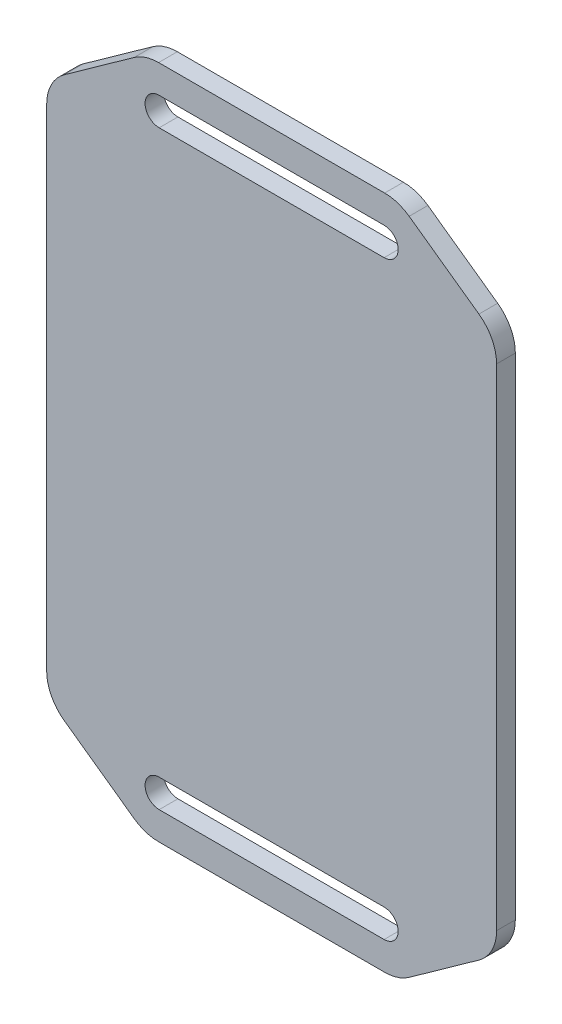
ISO-10303-21;
HEADER;
FILE_DESCRIPTION(('STEP AP214'),'2;1');
FILE_NAME('part.step','',(''),(''),'','','');
FILE_SCHEMA(('AUTOMOTIVE_DESIGN { 1 0 10303 214 1 1 1 1 }'));
ENDSEC;
DATA;
#1=APPLICATION_CONTEXT('core data for automotive mechanical design processes');
#2=APPLICATION_PROTOCOL_DEFINITION('international standard','automotive_design',2000,#1);
#3=PRODUCT_CONTEXT('',#1,'mechanical');
#4=PRODUCT('Part','Part','',(#3));
#5=PRODUCT_RELATED_PRODUCT_CATEGORY('part','',(#4));
#6=PRODUCT_DEFINITION_FORMATION('','',#4);
#7=PRODUCT_DEFINITION_CONTEXT('part definition',#1,'design');
#8=PRODUCT_DEFINITION('design','',#6,#7);
#9=PRODUCT_DEFINITION_SHAPE('','',#8);
#10=(LENGTH_UNIT() NAMED_UNIT(*) SI_UNIT(.MILLI.,.METRE.));
#11=(NAMED_UNIT(*) PLANE_ANGLE_UNIT() SI_UNIT($,.RADIAN.));
#12=(NAMED_UNIT(*) SI_UNIT($,.STERADIAN.) SOLID_ANGLE_UNIT());
#13=UNCERTAINTY_MEASURE_WITH_UNIT(LENGTH_MEASURE(1.E-05),#10,'distance_accuracy_value','');
#14=(GEOMETRIC_REPRESENTATION_CONTEXT(3) GLOBAL_UNCERTAINTY_ASSIGNED_CONTEXT((#13)) GLOBAL_UNIT_ASSIGNED_CONTEXT((#10,
#11,#12)) REPRESENTATION_CONTEXT('',''));
#15=CARTESIAN_POINT('',(0.,0.,0.));
#16=DIRECTION('',(0.,0.,1.));
#17=DIRECTION('',(1.,0.,0.));
#18=AXIS2_PLACEMENT_3D('',#15,#16,#17);
#19=CARTESIAN_POINT('',(195.595995895777,161.842834793224,2.));
#20=DIRECTION('',(0.,0.,1.));
#21=DIRECTION('',(1.,0.,0.));
#22=AXIS2_PLACEMENT_3D('',#19,#20,#21);
#23=PLANE('',#22);
#24=DIRECTION('',(1.,0.,0.));
#25=VECTOR('',#24,1.);
#26=CARTESIAN_POINT('',(164.0959958958,155.0270542645,2.));
#27=LINE('',#26,#25);
#28=CARTESIAN_POINT('',(164.0959958958,155.0270542645,2.));
#29=VERTEX_POINT('',#28);
#30=CARTESIAN_POINT('',(188.0959958958,155.0270542645,2.));
#31=VERTEX_POINT('',#30);
#32=EDGE_CURVE('E231',#29,#31,#27,.T.);
#33=ORIENTED_EDGE('',*,*,#32,.F.);
#34=CARTESIAN_POINT('',(164.0959958958,156.5270542645,2.));
#35=DIRECTION('',(0.,0.,1.));
#36=DIRECTION('',(1.,0.,0.));
#37=AXIS2_PLACEMENT_3D('',#34,#35,#36);
#38=CIRCLE('',#37,1.5);
#39=CARTESIAN_POINT('',(164.0959958958,158.0270542645,2.));
#40=VERTEX_POINT('',#39);
#41=EDGE_CURVE('E229',#40,#29,#38,.T.);
#42=ORIENTED_EDGE('',*,*,#41,.F.);
#43=DIRECTION('',(-1.,0.,0.));
#44=VECTOR('',#43,1.);
#45=CARTESIAN_POINT('',(164.0959958958,158.0270542645,2.));
#46=LINE('',#45,#44);
#47=CARTESIAN_POINT('',(188.0959958958,158.0270542645,2.));
#48=VERTEX_POINT('',#47);
#49=EDGE_CURVE('E237',#48,#40,#46,.T.);
#50=ORIENTED_EDGE('',*,*,#49,.F.);
#51=CARTESIAN_POINT('',(188.0959958958,156.5270542645,2.));
#52=DIRECTION('',(0.,0.,1.));
#53=DIRECTION('',(1.,0.,0.));
#54=AXIS2_PLACEMENT_3D('',#51,#52,#53);
#55=CIRCLE('',#54,1.5);
#56=EDGE_CURVE('E234',#31,#48,#55,.T.);
#57=ORIENTED_EDGE('',*,*,#56,.F.);
#58=EDGE_LOOP('',(#33,#42,#50,#57));
#59=FACE_BOUND('',#58,.T.);
#60=CARTESIAN_POINT('',(195.595995895777,161.842834793224,2.));
#61=DIRECTION('',(0.,0.,1.));
#62=DIRECTION('',(1.,0.,0.));
#63=AXIS2_PLACEMENT_3D('',#60,#61,#62);
#64=CIRCLE('',#63,4.50000000000631);
#65=CARTESIAN_POINT('',(198.211567767574,158.181034172829,2.));
#66=VERTEX_POINT('',#65);
#67=CARTESIAN_POINT('',(200.095995895783,161.842834793224,2.));
#68=VERTEX_POINT('',#67);
#69=EDGE_CURVE('E260',#66,#68,#64,.T.);
#70=ORIENTED_EDGE('',*,*,#69,.T.);
#71=DIRECTION('',(0.,1.,0.));
#72=VECTOR('',#71,1.);
#73=CARTESIAN_POINT('',(200.095995895783,161.842834793224,2.));
#74=LINE('',#73,#72);
#75=CARTESIAN_POINT('',(200.095995895783,214.210663326024,2.));
#76=VERTEX_POINT('',#75);
#77=EDGE_CURVE('E263',#68,#76,#74,.T.);
#78=ORIENTED_EDGE('',*,*,#77,.T.);
#79=CARTESIAN_POINT('',(195.595995895777,214.210663326176,2.));
#80=DIRECTION('',(0.,0.,1.));
#81=DIRECTION('',(1.,0.,0.));
#82=AXIS2_PLACEMENT_3D('',#79,#80,#81);
#83=CIRCLE('',#82,4.50000000000633);
#84=CARTESIAN_POINT('',(198.211567767574,217.872463946571,2.));
#85=VERTEX_POINT('',#84);
#86=EDGE_CURVE('E266',#76,#85,#83,.T.);
#87=ORIENTED_EDGE('',*,*,#86,.T.);
#88=DIRECTION('',(-0.81373347120969,0.581238193714959,0.));
#89=VECTOR('',#88,1.);
#90=CARTESIAN_POINT('',(190.769475027174,223.188244475371,2.));
#91=LINE('',#90,#89);
#92=CARTESIAN_POINT('',(190.769475027174,223.188244475371,2.));
#93=VERTEX_POINT('',#92);
#94=EDGE_CURVE('E268',#85,#93,#91,.T.);
#95=ORIENTED_EDGE('',*,*,#94,.T.);
#96=CARTESIAN_POINT('',(188.15390315546,219.526443854953,2.));
#97=DIRECTION('',(0.,0.,1.));
#98=DIRECTION('',(1.,0.,0.));
#99=AXIS2_PLACEMENT_3D('',#96,#97,#98);
#100=CIRCLE('',#99,4.49999999997727);
#101=CARTESIAN_POINT('',(188.15390315546,224.02644385493,2.));
#102=VERTEX_POINT('',#101);
#103=EDGE_CURVE('E270',#93,#102,#100,.T.);
#104=ORIENTED_EDGE('',*,*,#103,.T.);
#105=DIRECTION('',(-1.,0.,0.));
#106=VECTOR('',#105,1.);
#107=CARTESIAN_POINT('',(188.15390315546,224.02644385493,2.));
#108=LINE('',#107,#106);
#109=CARTESIAN_POINT('',(164.03808863616,224.02644385493,2.));
#110=VERTEX_POINT('',#109);
#111=EDGE_CURVE('E272',#102,#110,#108,.T.);
#112=ORIENTED_EDGE('',*,*,#111,.T.);
#113=CARTESIAN_POINT('',(164.03808863616,219.526443854924,2.));
#114=DIRECTION('',(0.,0.,1.));
#115=DIRECTION('',(1.,0.,0.));
#116=AXIS2_PLACEMENT_3D('',#113,#114,#115);
#117=CIRCLE('',#116,4.50000000000631);
#118=CARTESIAN_POINT('',(161.422516764364,223.188244475319,2.));
#119=VERTEX_POINT('',#118);
#120=EDGE_CURVE('E274',#110,#119,#117,.T.);
#121=ORIENTED_EDGE('',*,*,#120,.T.);
#122=DIRECTION('',(-0.813733471205996,-0.581238193720131,0.));
#123=VECTOR('',#122,1.);
#124=CARTESIAN_POINT('',(153.980424024064,217.872463946518,2.));
#125=LINE('',#124,#123);
#126=CARTESIAN_POINT('',(153.980424024064,217.872463946518,2.));
#127=VERTEX_POINT('',#126);
#128=EDGE_CURVE('E276',#119,#127,#125,.T.);
#129=ORIENTED_EDGE('',*,*,#128,.T.);
#130=CARTESIAN_POINT('',(156.595995895777,214.2106633261,2.));
#131=DIRECTION('',(0.,0.,1.));
#132=DIRECTION('',(1.,0.,0.));
#133=AXIS2_PLACEMENT_3D('',#130,#131,#132);
#134=CIRCLE('',#133,4.49999999997724);
#135=CARTESIAN_POINT('',(152.0959958958,214.2106633261,2.));
#136=VERTEX_POINT('',#135);
#137=EDGE_CURVE('E278',#127,#136,#134,.T.);
#138=ORIENTED_EDGE('',*,*,#137,.T.);
#139=DIRECTION('',(0.,-1.,0.));
#140=VECTOR('',#139,1.);
#141=CARTESIAN_POINT('',(152.0959958958,161.8428347933,2.));
#142=LINE('',#141,#140);
#143=CARTESIAN_POINT('',(152.0959958958,161.8428347933,2.));
#144=VERTEX_POINT('',#143);
#145=EDGE_CURVE('E280',#136,#144,#142,.T.);
#146=ORIENTED_EDGE('',*,*,#145,.T.);
#147=CARTESIAN_POINT('',(156.595995895777,161.8428347933,2.));
#148=DIRECTION('',(0.,0.,1.));
#149=DIRECTION('',(1.,0.,0.));
#150=AXIS2_PLACEMENT_3D('',#147,#148,#149);
#151=CIRCLE('',#150,4.49999999997719);
#152=CARTESIAN_POINT('',(153.980424024064,158.181034172881,2.));
#153=VERTEX_POINT('',#152);
#154=EDGE_CURVE('E282',#144,#153,#151,.T.);
#155=ORIENTED_EDGE('',*,*,#154,.T.);
#156=DIRECTION('',(0.813733471205996,-0.581238193720131,0.));
#157=VECTOR('',#156,1.);
#158=CARTESIAN_POINT('',(153.980424024064,158.181034172881,2.));
#159=LINE('',#158,#157);
#160=CARTESIAN_POINT('',(161.422516764364,152.865253644081,2.));
#161=VERTEX_POINT('',#160);
#162=EDGE_CURVE('E284',#153,#161,#159,.T.);
#163=ORIENTED_EDGE('',*,*,#162,.T.);
#164=CARTESIAN_POINT('',(164.03808863616,156.527054264476,2.));
#165=DIRECTION('',(0.,0.,1.));
#166=DIRECTION('',(1.,0.,0.));
#167=AXIS2_PLACEMENT_3D('',#164,#165,#166);
#168=CIRCLE('',#167,4.50000000000623);
#169=CARTESIAN_POINT('',(164.03808863616,152.02705426447,2.));
#170=VERTEX_POINT('',#169);
#171=EDGE_CURVE('E286',#161,#170,#168,.T.);
#172=ORIENTED_EDGE('',*,*,#171,.T.);
#173=DIRECTION('',(1.,0.,0.));
#174=VECTOR('',#173,1.);
#175=CARTESIAN_POINT('',(164.03808863616,152.02705426447,2.));
#176=LINE('',#175,#174);
#177=CARTESIAN_POINT('',(188.15390315546,152.02705426447,2.));
#178=VERTEX_POINT('',#177);
#179=EDGE_CURVE('E288',#170,#178,#176,.T.);
#180=ORIENTED_EDGE('',*,*,#179,.T.);
#181=CARTESIAN_POINT('',(188.15390315546,156.527054264447,2.));
#182=DIRECTION('',(0.,0.,1.));
#183=DIRECTION('',(1.,0.,0.));
#184=AXIS2_PLACEMENT_3D('',#181,#182,#183);
#185=CIRCLE('',#184,4.4999999999772);
#186=CARTESIAN_POINT('',(190.769475027174,152.865253644029,2.));
#187=VERTEX_POINT('',#186);
#188=EDGE_CURVE('E290',#178,#187,#185,.T.);
#189=ORIENTED_EDGE('',*,*,#188,.T.);
#190=DIRECTION('',(0.81373347120969,0.581238193714959,0.));
#191=VECTOR('',#190,1.);
#192=CARTESIAN_POINT('',(190.769475027174,152.865253644029,2.));
#193=LINE('',#192,#191);
#194=EDGE_CURVE('E292',#187,#66,#193,.T.);
#195=ORIENTED_EDGE('',*,*,#194,.T.);
#196=EDGE_LOOP('',(#70,#78,#87,#95,#104,#112,#121,#129,#138,#146,#155,#163,#172,#180,#189,#195));
#197=FACE_BOUND('',#196,.T.);
#198=DIRECTION('',(1.,0.,0.));
#199=VECTOR('',#198,1.);
#200=CARTESIAN_POINT('',(164.0959958958,218.0270542645,2.));
#201=LINE('',#200,#199);
#202=CARTESIAN_POINT('',(164.0959958958,218.0270542645,2.));
#203=VERTEX_POINT('',#202);
#204=CARTESIAN_POINT('',(188.0959958958,218.0270542645,2.));
#205=VERTEX_POINT('',#204);
#206=EDGE_CURVE('E201',#203,#205,#201,.T.);
#207=ORIENTED_EDGE('',*,*,#206,.F.);
#208=CARTESIAN_POINT('',(164.0959958958,219.5270542645,2.));
#209=DIRECTION('',(0.,0.,1.));
#210=DIRECTION('',(1.,0.,0.));
#211=AXIS2_PLACEMENT_3D('',#208,#209,#210);
#212=CIRCLE('',#211,1.5);
#213=CARTESIAN_POINT('',(164.0959958958,221.0270542645,2.));
#214=VERTEX_POINT('',#213);
#215=EDGE_CURVE('E193',#214,#203,#212,.T.);
#216=ORIENTED_EDGE('',*,*,#215,.F.);
#217=DIRECTION('',(-1.,0.,0.));
#218=VECTOR('',#217,1.);
#219=CARTESIAN_POINT('',(164.0959958958,221.0270542645,2.));
#220=LINE('',#219,#218);
#221=CARTESIAN_POINT('',(188.0959958958,221.0270542645,2.));
#222=VERTEX_POINT('',#221);
#223=EDGE_CURVE('E215',#222,#214,#220,.T.);
#224=ORIENTED_EDGE('',*,*,#223,.F.);
#225=CARTESIAN_POINT('',(188.0959958958,219.5270542645,2.));
#226=DIRECTION('',(0.,0.,1.));
#227=DIRECTION('',(1.,0.,0.));
#228=AXIS2_PLACEMENT_3D('',#225,#226,#227);
#229=CIRCLE('',#228,1.5);
#230=EDGE_CURVE('E213',#205,#222,#229,.T.);
#231=ORIENTED_EDGE('',*,*,#230,.F.);
#232=EDGE_LOOP('',(#207,#216,#224,#231));
#233=FACE_BOUND('',#232,.T.);
#234=ADVANCED_FACE('F32',(#59,#197,#233),#23,.T.);
#235=CARTESIAN_POINT('',(195.595995895777,161.842834793224,0.));
#236=DIRECTION('',(0.,0.,1.));
#237=DIRECTION('',(1.,0.,0.));
#238=AXIS2_PLACEMENT_3D('',#235,#236,#237);
#239=PLANE('',#238);
#240=CARTESIAN_POINT('',(164.0959958958,156.5270542645,0.));
#241=DIRECTION('',(0.,0.,1.));
#242=DIRECTION('',(1.,0.,0.));
#243=AXIS2_PLACEMENT_3D('',#240,#241,#242);
#244=CIRCLE('',#243,1.5);
#245=CARTESIAN_POINT('',(164.0959958958,158.0270542645,0.));
#246=VERTEX_POINT('',#245);
#247=CARTESIAN_POINT('',(164.0959958958,155.0270542645,0.));
#248=VERTEX_POINT('',#247);
#249=EDGE_CURVE('E209',#246,#248,#244,.T.);
#250=ORIENTED_EDGE('',*,*,#249,.T.);
#251=DIRECTION('',(1.,0.,0.));
#252=VECTOR('',#251,1.);
#253=CARTESIAN_POINT('',(164.0959958958,155.0270542645,0.));
#254=LINE('',#253,#252);
#255=CARTESIAN_POINT('',(188.0959958958,155.0270542645,0.));
#256=VERTEX_POINT('',#255);
#257=EDGE_CURVE('E242',#248,#256,#254,.T.);
#258=ORIENTED_EDGE('',*,*,#257,.T.);
#259=CARTESIAN_POINT('',(188.0959958958,156.5270542645,0.));
#260=DIRECTION('',(0.,0.,1.));
#261=DIRECTION('',(1.,0.,0.));
#262=AXIS2_PLACEMENT_3D('',#259,#260,#261);
#263=CIRCLE('',#262,1.5);
#264=CARTESIAN_POINT('',(188.0959958958,158.0270542645,0.));
#265=VERTEX_POINT('',#264);
#266=EDGE_CURVE('E245',#256,#265,#263,.T.);
#267=ORIENTED_EDGE('',*,*,#266,.T.);
#268=DIRECTION('',(-1.,0.,0.));
#269=VECTOR('',#268,1.);
#270=CARTESIAN_POINT('',(164.0959958958,158.0270542645,0.));
#271=LINE('',#270,#269);
#272=EDGE_CURVE('E232',#265,#246,#271,.T.);
#273=ORIENTED_EDGE('',*,*,#272,.T.);
#274=EDGE_LOOP('',(#250,#258,#267,#273));
#275=FACE_BOUND('',#274,.T.);
#276=CARTESIAN_POINT('',(195.595995895777,161.842834793224,0.));
#277=DIRECTION('',(0.,0.,1.));
#278=DIRECTION('',(1.,0.,0.));
#279=AXIS2_PLACEMENT_3D('',#276,#277,#278);
#280=CIRCLE('',#279,4.50000000000631);
#281=CARTESIAN_POINT('',(198.211567767574,158.181034172829,0.));
#282=VERTEX_POINT('',#281);
#283=CARTESIAN_POINT('',(200.095995895783,161.842834793224,0.));
#284=VERTEX_POINT('',#283);
#285=EDGE_CURVE('E259',#282,#284,#280,.T.);
#286=ORIENTED_EDGE('',*,*,#285,.F.);
#287=DIRECTION('',(0.81373347120969,0.581238193714959,0.));
#288=VECTOR('',#287,1.);
#289=CARTESIAN_POINT('',(190.769475027174,152.865253644029,0.));
#290=LINE('',#289,#288);
#291=CARTESIAN_POINT('',(190.769475027174,152.865253644029,0.));
#292=VERTEX_POINT('',#291);
#293=EDGE_CURVE('E264',#292,#282,#290,.T.);
#294=ORIENTED_EDGE('',*,*,#293,.F.);
#295=CARTESIAN_POINT('',(188.15390315546,156.527054264447,0.));
#296=DIRECTION('',(0.,0.,1.));
#297=DIRECTION('',(1.,0.,0.));
#298=AXIS2_PLACEMENT_3D('',#295,#296,#297);
#299=CIRCLE('',#298,4.4999999999772);
#300=CARTESIAN_POINT('',(188.15390315546,152.02705426447,0.));
#301=VERTEX_POINT('',#300);
#302=EDGE_CURVE('E323',#301,#292,#299,.T.);
#303=ORIENTED_EDGE('',*,*,#302,.F.);
#304=DIRECTION('',(1.,0.,0.));
#305=VECTOR('',#304,1.);
#306=CARTESIAN_POINT('',(164.03808863616,152.02705426447,0.));
#307=LINE('',#306,#305);
#308=CARTESIAN_POINT('',(164.03808863616,152.02705426447,0.));
#309=VERTEX_POINT('',#308);
#310=EDGE_CURVE('E321',#309,#301,#307,.T.);
#311=ORIENTED_EDGE('',*,*,#310,.F.);
#312=CARTESIAN_POINT('',(164.03808863616,156.527054264476,0.));
#313=DIRECTION('',(0.,0.,1.));
#314=DIRECTION('',(1.,0.,0.));
#315=AXIS2_PLACEMENT_3D('',#312,#313,#314);
#316=CIRCLE('',#315,4.50000000000623);
#317=CARTESIAN_POINT('',(161.422516764364,152.865253644081,0.));
#318=VERTEX_POINT('',#317);
#319=EDGE_CURVE('E319',#318,#309,#316,.T.);
#320=ORIENTED_EDGE('',*,*,#319,.F.);
#321=DIRECTION('',(0.813733471205996,-0.581238193720131,0.));
#322=VECTOR('',#321,1.);
#323=CARTESIAN_POINT('',(153.980424024064,158.181034172881,0.));
#324=LINE('',#323,#322);
#325=CARTESIAN_POINT('',(153.980424024064,158.181034172881,0.));
#326=VERTEX_POINT('',#325);
#327=EDGE_CURVE('E317',#326,#318,#324,.T.);
#328=ORIENTED_EDGE('',*,*,#327,.F.);
#329=CARTESIAN_POINT('',(156.595995895777,161.8428347933,0.));
#330=DIRECTION('',(0.,0.,1.));
#331=DIRECTION('',(1.,0.,0.));
#332=AXIS2_PLACEMENT_3D('',#329,#330,#331);
#333=CIRCLE('',#332,4.49999999997719);
#334=CARTESIAN_POINT('',(152.0959958958,161.8428347933,0.));
#335=VERTEX_POINT('',#334);
#336=EDGE_CURVE('E315',#335,#326,#333,.T.);
#337=ORIENTED_EDGE('',*,*,#336,.F.);
#338=DIRECTION('',(0.,-1.,0.));
#339=VECTOR('',#338,1.);
#340=CARTESIAN_POINT('',(152.0959958958,161.8428347933,0.));
#341=LINE('',#340,#339);
#342=CARTESIAN_POINT('',(152.0959958958,214.2106633261,0.));
#343=VERTEX_POINT('',#342);
#344=EDGE_CURVE('E313',#343,#335,#341,.T.);
#345=ORIENTED_EDGE('',*,*,#344,.F.);
#346=CARTESIAN_POINT('',(156.595995895777,214.2106633261,0.));
#347=DIRECTION('',(0.,0.,1.));
#348=DIRECTION('',(1.,0.,0.));
#349=AXIS2_PLACEMENT_3D('',#346,#347,#348);
#350=CIRCLE('',#349,4.49999999997724);
#351=CARTESIAN_POINT('',(153.980424024064,217.872463946518,0.));
#352=VERTEX_POINT('',#351);
#353=EDGE_CURVE('E311',#352,#343,#350,.T.);
#354=ORIENTED_EDGE('',*,*,#353,.F.);
#355=DIRECTION('',(-0.813733471205996,-0.581238193720131,0.));
#356=VECTOR('',#355,1.);
#357=CARTESIAN_POINT('',(153.980424024064,217.872463946518,0.));
#358=LINE('',#357,#356);
#359=CARTESIAN_POINT('',(161.422516764364,223.188244475319,0.));
#360=VERTEX_POINT('',#359);
#361=EDGE_CURVE('E309',#360,#352,#358,.T.);
#362=ORIENTED_EDGE('',*,*,#361,.F.);
#363=CARTESIAN_POINT('',(164.03808863616,219.526443854924,0.));
#364=DIRECTION('',(0.,0.,1.));
#365=DIRECTION('',(1.,0.,0.));
#366=AXIS2_PLACEMENT_3D('',#363,#364,#365);
#367=CIRCLE('',#366,4.50000000000631);
#368=CARTESIAN_POINT('',(164.03808863616,224.02644385493,0.));
#369=VERTEX_POINT('',#368);
#370=EDGE_CURVE('E307',#369,#360,#367,.T.);
#371=ORIENTED_EDGE('',*,*,#370,.F.);
#372=DIRECTION('',(-1.,0.,0.));
#373=VECTOR('',#372,1.);
#374=CARTESIAN_POINT('',(188.15390315546,224.02644385493,0.));
#375=LINE('',#374,#373);
#376=CARTESIAN_POINT('',(188.15390315546,224.02644385493,0.));
#377=VERTEX_POINT('',#376);
#378=EDGE_CURVE('E305',#377,#369,#375,.T.);
#379=ORIENTED_EDGE('',*,*,#378,.F.);
#380=CARTESIAN_POINT('',(188.15390315546,219.526443854953,0.));
#381=DIRECTION('',(0.,0.,1.));
#382=DIRECTION('',(1.,0.,0.));
#383=AXIS2_PLACEMENT_3D('',#380,#381,#382);
#384=CIRCLE('',#383,4.49999999997727);
#385=CARTESIAN_POINT('',(190.769475027174,223.188244475371,0.));
#386=VERTEX_POINT('',#385);
#387=EDGE_CURVE('E303',#386,#377,#384,.T.);
#388=ORIENTED_EDGE('',*,*,#387,.F.);
#389=DIRECTION('',(-0.81373347120969,0.581238193714959,0.));
#390=VECTOR('',#389,1.);
#391=CARTESIAN_POINT('',(190.769475027174,223.188244475371,0.));
#392=LINE('',#391,#390);
#393=CARTESIAN_POINT('',(198.211567767574,217.872463946571,0.));
#394=VERTEX_POINT('',#393);
#395=EDGE_CURVE('E301',#394,#386,#392,.T.);
#396=ORIENTED_EDGE('',*,*,#395,.F.);
#397=CARTESIAN_POINT('',(195.595995895777,214.210663326176,0.));
#398=DIRECTION('',(0.,0.,1.));
#399=DIRECTION('',(1.,0.,0.));
#400=AXIS2_PLACEMENT_3D('',#397,#398,#399);
#401=CIRCLE('',#400,4.50000000000633);
#402=CARTESIAN_POINT('',(200.095995895783,214.210663326024,0.));
#403=VERTEX_POINT('',#402);
#404=EDGE_CURVE('E299',#403,#394,#401,.T.);
#405=ORIENTED_EDGE('',*,*,#404,.F.);
#406=DIRECTION('',(0.,1.,0.));
#407=VECTOR('',#406,1.);
#408=CARTESIAN_POINT('',(200.095995895783,161.842834793224,0.));
#409=LINE('',#408,#407);
#410=EDGE_CURVE('E297',#284,#403,#409,.T.);
#411=ORIENTED_EDGE('',*,*,#410,.F.);
#412=EDGE_LOOP('',(#286,#294,#303,#311,#320,#328,#337,#345,#354,#362,#371,#379,#388,#396,#405,#411));
#413=FACE_BOUND('',#412,.T.);
#414=CARTESIAN_POINT('',(164.0959958958,219.5270542645,0.));
#415=DIRECTION('',(0.,0.,1.));
#416=DIRECTION('',(1.,0.,0.));
#417=AXIS2_PLACEMENT_3D('',#414,#415,#416);
#418=CIRCLE('',#417,1.5);
#419=CARTESIAN_POINT('',(164.0959958958,221.0270542645,0.));
#420=VERTEX_POINT('',#419);
#421=CARTESIAN_POINT('',(164.0959958958,218.0270542645,0.));
#422=VERTEX_POINT('',#421);
#423=EDGE_CURVE('E55',#420,#422,#418,.T.);
#424=ORIENTED_EDGE('',*,*,#423,.T.);
#425=DIRECTION('',(1.,0.,0.));
#426=VECTOR('',#425,1.);
#427=CARTESIAN_POINT('',(164.0959958958,218.0270542645,0.));
#428=LINE('',#427,#426);
#429=CARTESIAN_POINT('',(188.0959958958,218.0270542645,0.));
#430=VERTEX_POINT('',#429);
#431=EDGE_CURVE('E208',#422,#430,#428,.T.);
#432=ORIENTED_EDGE('',*,*,#431,.T.);
#433=CARTESIAN_POINT('',(188.0959958958,219.5270542645,0.));
#434=DIRECTION('',(0.,0.,1.));
#435=DIRECTION('',(1.,0.,0.));
#436=AXIS2_PLACEMENT_3D('',#433,#434,#435);
#437=CIRCLE('',#436,1.5);
#438=CARTESIAN_POINT('',(188.0959958958,221.0270542645,0.));
#439=VERTEX_POINT('',#438);
#440=EDGE_CURVE('E221',#430,#439,#437,.T.);
#441=ORIENTED_EDGE('',*,*,#440,.T.);
#442=DIRECTION('',(-1.,0.,0.));
#443=VECTOR('',#442,1.);
#444=CARTESIAN_POINT('',(164.0959958958,221.0270542645,0.));
#445=LINE('',#444,#443);
#446=EDGE_CURVE('E202',#439,#420,#445,.T.);
#447=ORIENTED_EDGE('',*,*,#446,.T.);
#448=EDGE_LOOP('',(#424,#432,#441,#447));
#449=FACE_BOUND('',#448,.T.);
#450=ADVANCED_FACE('F377',(#275,#413,#449),#239,.F.);
#451=CARTESIAN_POINT('',(195.595995895777,161.842834793224,2.));
#452=DIRECTION('',(0.,0.,-1.));
#453=DIRECTION('',(-1.,0.,0.));
#454=AXIS2_PLACEMENT_3D('',#451,#452,#453);
#455=CYLINDRICAL_SURFACE('',#454,4.50000000000631);
#456=ORIENTED_EDGE('',*,*,#285,.T.);
#457=DIRECTION('',(0.,0.,-1.));
#458=VECTOR('',#457,1.);
#459=CARTESIAN_POINT('',(200.095995895783,161.842834793224,2.));
#460=LINE('',#459,#458);
#461=EDGE_CURVE('E11',#68,#284,#460,.T.);
#462=ORIENTED_EDGE('',*,*,#461,.F.);
#463=ORIENTED_EDGE('',*,*,#69,.F.);
#464=DIRECTION('',(0.,0.,-1.));
#465=VECTOR('',#464,1.);
#466=CARTESIAN_POINT('',(198.211567767574,158.181034172829,2.));
#467=LINE('',#466,#465);
#468=EDGE_CURVE('E294',#66,#282,#467,.T.);
#469=ORIENTED_EDGE('',*,*,#468,.T.);
#470=EDGE_LOOP('',(#456,#462,#463,#469));
#471=FACE_BOUND('',#470,.T.);
#472=ADVANCED_FACE('F34',(#471),#455,.T.);
#473=CARTESIAN_POINT('',(200.095995895783,161.842834793224,2.));
#474=DIRECTION('',(-1.,0.,0.));
#475=DIRECTION('',(0.,0.,1.));
#476=AXIS2_PLACEMENT_3D('',#473,#474,#475);
#477=PLANE('',#476);
#478=ORIENTED_EDGE('',*,*,#410,.T.);
#479=DIRECTION('',(0.,0.,-1.));
#480=VECTOR('',#479,1.);
#481=CARTESIAN_POINT('',(200.095995895783,214.210663326024,2.));
#482=LINE('',#481,#480);
#483=EDGE_CURVE('E40',#76,#403,#482,.T.);
#484=ORIENTED_EDGE('',*,*,#483,.F.);
#485=ORIENTED_EDGE('',*,*,#77,.F.);
#486=ORIENTED_EDGE('',*,*,#461,.T.);
#487=EDGE_LOOP('',(#478,#484,#485,#486));
#488=FACE_BOUND('',#487,.T.);
#489=ADVANCED_FACE('F394',(#488),#477,.F.);
#490=CARTESIAN_POINT('',(195.595995895777,214.210663326176,2.));
#491=DIRECTION('',(0.,0.,-1.));
#492=DIRECTION('',(-1.,0.,0.));
#493=AXIS2_PLACEMENT_3D('',#490,#491,#492);
#494=CYLINDRICAL_SURFACE('',#493,4.50000000000633);
#495=ORIENTED_EDGE('',*,*,#404,.T.);
#496=DIRECTION('',(0.,0.,-1.));
#497=VECTOR('',#496,1.);
#498=CARTESIAN_POINT('',(198.211567767574,217.872463946571,2.));
#499=LINE('',#498,#497);
#500=EDGE_CURVE('E364',#85,#394,#499,.T.);
#501=ORIENTED_EDGE('',*,*,#500,.F.);
#502=ORIENTED_EDGE('',*,*,#86,.F.);
#503=ORIENTED_EDGE('',*,*,#483,.T.);
#504=EDGE_LOOP('',(#495,#501,#502,#503));
#505=FACE_BOUND('',#504,.T.);
#506=ADVANCED_FACE('F371',(#505),#494,.T.);
#507=CARTESIAN_POINT('',(190.769475027174,223.188244475371,2.));
#508=DIRECTION('',(-0.581238193714959,-0.81373347120969,0.));
#509=DIRECTION('',(0.81373347120969,-0.581238193714959,0.));
#510=AXIS2_PLACEMENT_3D('',#507,#508,#509);
#511=PLANE('',#510);
#512=ORIENTED_EDGE('',*,*,#395,.T.);
#513=DIRECTION('',(0.,0.,-1.));
#514=VECTOR('',#513,1.);
#515=CARTESIAN_POINT('',(190.769475027174,223.188244475371,2.));
#516=LINE('',#515,#514);
#517=EDGE_CURVE('E361',#93,#386,#516,.T.);
#518=ORIENTED_EDGE('',*,*,#517,.F.);
#519=ORIENTED_EDGE('',*,*,#94,.F.);
#520=ORIENTED_EDGE('',*,*,#500,.T.);
#521=EDGE_LOOP('',(#512,#518,#519,#520));
#522=FACE_BOUND('',#521,.T.);
#523=ADVANCED_FACE('F383',(#522),#511,.F.);
#524=CARTESIAN_POINT('',(188.15390315546,219.526443854953,2.));
#525=DIRECTION('',(0.,0.,-1.));
#526=DIRECTION('',(-1.,0.,0.));
#527=AXIS2_PLACEMENT_3D('',#524,#525,#526);
#528=CYLINDRICAL_SURFACE('',#527,4.49999999997727);
#529=ORIENTED_EDGE('',*,*,#387,.T.);
#530=DIRECTION('',(0.,0.,-1.));
#531=VECTOR('',#530,1.);
#532=CARTESIAN_POINT('',(188.15390315546,224.02644385493,2.));
#533=LINE('',#532,#531);
#534=EDGE_CURVE('E358',#102,#377,#533,.T.);
#535=ORIENTED_EDGE('',*,*,#534,.F.);
#536=ORIENTED_EDGE('',*,*,#103,.F.);
#537=ORIENTED_EDGE('',*,*,#517,.T.);
#538=EDGE_LOOP('',(#529,#535,#536,#537));
#539=FACE_BOUND('',#538,.T.);
#540=ADVANCED_FACE('F387',(#539),#528,.T.);
#541=CARTESIAN_POINT('',(188.15390315546,224.02644385493,2.));
#542=DIRECTION('',(0.,-1.,0.));
#543=DIRECTION('',(0.,0.,-1.));
#544=AXIS2_PLACEMENT_3D('',#541,#542,#543);
#545=PLANE('',#544);
#546=ORIENTED_EDGE('',*,*,#378,.T.);
#547=DIRECTION('',(0.,0.,-1.));
#548=VECTOR('',#547,1.);
#549=CARTESIAN_POINT('',(164.03808863616,224.02644385493,2.));
#550=LINE('',#549,#548);
#551=EDGE_CURVE('E355',#110,#369,#550,.T.);
#552=ORIENTED_EDGE('',*,*,#551,.F.);
#553=ORIENTED_EDGE('',*,*,#111,.F.);
#554=ORIENTED_EDGE('',*,*,#534,.T.);
#555=EDGE_LOOP('',(#546,#552,#553,#554));
#556=FACE_BOUND('',#555,.T.);
#557=ADVANCED_FACE('F447',(#556),#545,.F.);
#558=CARTESIAN_POINT('',(164.03808863616,219.526443854924,2.));
#559=DIRECTION('',(0.,0.,-1.));
#560=DIRECTION('',(-1.,0.,0.));
#561=AXIS2_PLACEMENT_3D('',#558,#559,#560);
#562=CYLINDRICAL_SURFACE('',#561,4.50000000000631);
#563=ORIENTED_EDGE('',*,*,#370,.T.);
#564=DIRECTION('',(0.,0.,-1.));
#565=VECTOR('',#564,1.);
#566=CARTESIAN_POINT('',(161.422516764364,223.188244475319,2.));
#567=LINE('',#566,#565);
#568=EDGE_CURVE('E352',#119,#360,#567,.T.);
#569=ORIENTED_EDGE('',*,*,#568,.F.);
#570=ORIENTED_EDGE('',*,*,#120,.F.);
#571=ORIENTED_EDGE('',*,*,#551,.T.);
#572=EDGE_LOOP('',(#563,#569,#570,#571));
#573=FACE_BOUND('',#572,.T.);
#574=ADVANCED_FACE('F444',(#573),#562,.T.);
#575=CARTESIAN_POINT('',(153.980424024064,217.872463946518,2.));
#576=DIRECTION('',(0.581238193720131,-0.813733471205996,0.));
#577=DIRECTION('',(0.813733471205996,0.581238193720131,0.));
#578=AXIS2_PLACEMENT_3D('',#575,#576,#577);
#579=PLANE('',#578);
#580=ORIENTED_EDGE('',*,*,#361,.T.);
#581=DIRECTION('',(0.,0.,-1.));
#582=VECTOR('',#581,1.);
#583=CARTESIAN_POINT('',(153.980424024064,217.872463946518,2.));
#584=LINE('',#583,#582);
#585=EDGE_CURVE('E349',#127,#352,#584,.T.);
#586=ORIENTED_EDGE('',*,*,#585,.F.);
#587=ORIENTED_EDGE('',*,*,#128,.F.);
#588=ORIENTED_EDGE('',*,*,#568,.T.);
#589=EDGE_LOOP('',(#580,#586,#587,#588));
#590=FACE_BOUND('',#589,.T.);
#591=ADVANCED_FACE('F440',(#590),#579,.F.);
#592=CARTESIAN_POINT('',(156.595995895777,214.2106633261,2.));
#593=DIRECTION('',(0.,0.,-1.));
#594=DIRECTION('',(-1.,0.,0.));
#595=AXIS2_PLACEMENT_3D('',#592,#593,#594);
#596=CYLINDRICAL_SURFACE('',#595,4.49999999997724);
#597=ORIENTED_EDGE('',*,*,#353,.T.);
#598=DIRECTION('',(0.,0.,-1.));
#599=VECTOR('',#598,1.);
#600=CARTESIAN_POINT('',(152.0959958958,214.2106633261,2.));
#601=LINE('',#600,#599);
#602=EDGE_CURVE('E346',#136,#343,#601,.T.);
#603=ORIENTED_EDGE('',*,*,#602,.F.);
#604=ORIENTED_EDGE('',*,*,#137,.F.);
#605=ORIENTED_EDGE('',*,*,#585,.T.);
#606=EDGE_LOOP('',(#597,#603,#604,#605));
#607=FACE_BOUND('',#606,.T.);
#608=ADVANCED_FACE('F436',(#607),#596,.T.);
#609=CARTESIAN_POINT('',(152.0959958958,161.8428347933,2.));
#610=DIRECTION('',(1.,0.,0.));
#611=DIRECTION('',(0.,0.,-1.));
#612=AXIS2_PLACEMENT_3D('',#609,#610,#611);
#613=PLANE('',#612);
#614=ORIENTED_EDGE('',*,*,#344,.T.);
#615=DIRECTION('',(0.,0.,-1.));
#616=VECTOR('',#615,1.);
#617=CARTESIAN_POINT('',(152.0959958958,161.8428347933,2.));
#618=LINE('',#617,#616);
#619=EDGE_CURVE('E343',#144,#335,#618,.T.);
#620=ORIENTED_EDGE('',*,*,#619,.F.);
#621=ORIENTED_EDGE('',*,*,#145,.F.);
#622=ORIENTED_EDGE('',*,*,#602,.T.);
#623=EDGE_LOOP('',(#614,#620,#621,#622));
#624=FACE_BOUND('',#623,.T.);
#625=ADVANCED_FACE('F431',(#624),#613,.F.);
#626=CARTESIAN_POINT('',(156.595995895777,161.8428347933,2.));
#627=DIRECTION('',(0.,0.,-1.));
#628=DIRECTION('',(-1.,0.,0.));
#629=AXIS2_PLACEMENT_3D('',#626,#627,#628);
#630=CYLINDRICAL_SURFACE('',#629,4.49999999997719);
#631=ORIENTED_EDGE('',*,*,#336,.T.);
#632=DIRECTION('',(0.,0.,-1.));
#633=VECTOR('',#632,1.);
#634=CARTESIAN_POINT('',(153.980424024064,158.181034172881,2.));
#635=LINE('',#634,#633);
#636=EDGE_CURVE('E340',#153,#326,#635,.T.);
#637=ORIENTED_EDGE('',*,*,#636,.F.);
#638=ORIENTED_EDGE('',*,*,#154,.F.);
#639=ORIENTED_EDGE('',*,*,#619,.T.);
#640=EDGE_LOOP('',(#631,#637,#638,#639));
#641=FACE_BOUND('',#640,.T.);
#642=ADVANCED_FACE('F425',(#641),#630,.T.);
#643=CARTESIAN_POINT('',(153.980424024064,158.181034172881,2.));
#644=DIRECTION('',(0.581238193720131,0.813733471205996,0.));
#645=DIRECTION('',(-0.813733471205996,0.581238193720131,0.));
#646=AXIS2_PLACEMENT_3D('',#643,#644,#645);
#647=PLANE('',#646);
#648=ORIENTED_EDGE('',*,*,#327,.T.);
#649=DIRECTION('',(0.,0.,-1.));
#650=VECTOR('',#649,1.);
#651=CARTESIAN_POINT('',(161.422516764364,152.865253644081,2.));
#652=LINE('',#651,#650);
#653=EDGE_CURVE('E337',#161,#318,#652,.T.);
#654=ORIENTED_EDGE('',*,*,#653,.F.);
#655=ORIENTED_EDGE('',*,*,#162,.F.);
#656=ORIENTED_EDGE('',*,*,#636,.T.);
#657=EDGE_LOOP('',(#648,#654,#655,#656));
#658=FACE_BOUND('',#657,.T.);
#659=ADVANCED_FACE('F421',(#658),#647,.F.);
#660=CARTESIAN_POINT('',(164.03808863616,156.527054264476,2.));
#661=DIRECTION('',(0.,0.,-1.));
#662=DIRECTION('',(-1.,0.,0.));
#663=AXIS2_PLACEMENT_3D('',#660,#661,#662);
#664=CYLINDRICAL_SURFACE('',#663,4.50000000000623);
#665=ORIENTED_EDGE('',*,*,#319,.T.);
#666=DIRECTION('',(0.,0.,-1.));
#667=VECTOR('',#666,1.);
#668=CARTESIAN_POINT('',(164.03808863616,152.02705426447,2.));
#669=LINE('',#668,#667);
#670=EDGE_CURVE('E334',#170,#309,#669,.T.);
#671=ORIENTED_EDGE('',*,*,#670,.F.);
#672=ORIENTED_EDGE('',*,*,#171,.F.);
#673=ORIENTED_EDGE('',*,*,#653,.T.);
#674=EDGE_LOOP('',(#665,#671,#672,#673));
#675=FACE_BOUND('',#674,.T.);
#676=ADVANCED_FACE('F416',(#675),#664,.T.);
#677=CARTESIAN_POINT('',(164.03808863616,152.02705426447,2.));
#678=DIRECTION('',(0.,1.,0.));
#679=DIRECTION('',(0.,0.,1.));
#680=AXIS2_PLACEMENT_3D('',#677,#678,#679);
#681=PLANE('',#680);
#682=ORIENTED_EDGE('',*,*,#310,.T.);
#683=DIRECTION('',(0.,0.,-1.));
#684=VECTOR('',#683,1.);
#685=CARTESIAN_POINT('',(188.15390315546,152.02705426447,2.));
#686=LINE('',#685,#684);
#687=EDGE_CURVE('E331',#178,#301,#686,.T.);
#688=ORIENTED_EDGE('',*,*,#687,.F.);
#689=ORIENTED_EDGE('',*,*,#179,.F.);
#690=ORIENTED_EDGE('',*,*,#670,.T.);
#691=EDGE_LOOP('',(#682,#688,#689,#690));
#692=FACE_BOUND('',#691,.T.);
#693=ADVANCED_FACE('F410',(#692),#681,.F.);
#694=CARTESIAN_POINT('',(188.15390315546,156.527054264447,2.));
#695=DIRECTION('',(0.,0.,-1.));
#696=DIRECTION('',(-1.,0.,0.));
#697=AXIS2_PLACEMENT_3D('',#694,#695,#696);
#698=CYLINDRICAL_SURFACE('',#697,4.4999999999772);
#699=ORIENTED_EDGE('',*,*,#302,.T.);
#700=DIRECTION('',(0.,0.,-1.));
#701=VECTOR('',#700,1.);
#702=CARTESIAN_POINT('',(190.769475027174,152.865253644029,2.));
#703=LINE('',#702,#701);
#704=EDGE_CURVE('E328',#187,#292,#703,.T.);
#705=ORIENTED_EDGE('',*,*,#704,.F.);
#706=ORIENTED_EDGE('',*,*,#188,.F.);
#707=ORIENTED_EDGE('',*,*,#687,.T.);
#708=EDGE_LOOP('',(#699,#705,#706,#707));
#709=FACE_BOUND('',#708,.T.);
#710=ADVANCED_FACE('F406',(#709),#698,.T.);
#711=CARTESIAN_POINT('',(190.769475027174,152.865253644029,2.));
#712=DIRECTION('',(-0.581238193714959,0.81373347120969,0.));
#713=DIRECTION('',(-0.81373347120969,-0.581238193714959,0.));
#714=AXIS2_PLACEMENT_3D('',#711,#712,#713);
#715=PLANE('',#714);
#716=ORIENTED_EDGE('',*,*,#293,.T.);
#717=ORIENTED_EDGE('',*,*,#468,.F.);
#718=ORIENTED_EDGE('',*,*,#194,.F.);
#719=ORIENTED_EDGE('',*,*,#704,.T.);
#720=EDGE_LOOP('',(#716,#717,#718,#719));
#721=FACE_BOUND('',#720,.T.);
#722=ADVANCED_FACE('F401',(#721),#715,.F.);
#723=CARTESIAN_POINT('',(164.0959958958,156.5270542645,2.));
#724=DIRECTION('',(0.,0.,-1.));
#725=DIRECTION('',(-1.,0.,0.));
#726=AXIS2_PLACEMENT_3D('',#723,#724,#725);
#727=CYLINDRICAL_SURFACE('',#726,1.5);
#728=ORIENTED_EDGE('',*,*,#249,.F.);
#729=DIRECTION('',(0.,0.,-1.));
#730=VECTOR('',#729,1.);
#731=CARTESIAN_POINT('',(164.0959958958,158.0270542645,2.));
#732=LINE('',#731,#730);
#733=EDGE_CURVE('E239',#40,#246,#732,.T.);
#734=ORIENTED_EDGE('',*,*,#733,.F.);
#735=ORIENTED_EDGE('',*,*,#41,.T.);
#736=DIRECTION('',(0.,0.,-1.));
#737=VECTOR('',#736,1.);
#738=CARTESIAN_POINT('',(164.0959958958,155.0270542645,2.));
#739=LINE('',#738,#737);
#740=EDGE_CURVE('E256',#29,#248,#739,.T.);
#741=ORIENTED_EDGE('',*,*,#740,.T.);
#742=EDGE_LOOP('',(#728,#734,#735,#741));
#743=FACE_BOUND('',#742,.T.);
#744=ADVANCED_FACE('F466',(#743),#727,.F.);
#745=CARTESIAN_POINT('',(164.0959958958,155.0270542645,2.));
#746=DIRECTION('',(0.,1.,0.));
#747=DIRECTION('',(0.,0.,1.));
#748=AXIS2_PLACEMENT_3D('',#745,#746,#747);
#749=PLANE('',#748);
#750=ORIENTED_EDGE('',*,*,#257,.F.);
#751=ORIENTED_EDGE('',*,*,#740,.F.);
#752=ORIENTED_EDGE('',*,*,#32,.T.);
#753=DIRECTION('',(0.,0.,-1.));
#754=VECTOR('',#753,1.);
#755=CARTESIAN_POINT('',(188.0959958958,155.0270542645,2.));
#756=LINE('',#755,#754);
#757=EDGE_CURVE('E254',#31,#256,#756,.T.);
#758=ORIENTED_EDGE('',*,*,#757,.T.);
#759=EDGE_LOOP('',(#750,#751,#752,#758));
#760=FACE_BOUND('',#759,.T.);
#761=ADVANCED_FACE('F528',(#760),#749,.T.);
#762=CARTESIAN_POINT('',(188.0959958958,156.5270542645,2.));
#763=DIRECTION('',(0.,0.,-1.));
#764=DIRECTION('',(-1.,0.,0.));
#765=AXIS2_PLACEMENT_3D('',#762,#763,#764);
#766=CYLINDRICAL_SURFACE('',#765,1.5);
#767=ORIENTED_EDGE('',*,*,#266,.F.);
#768=ORIENTED_EDGE('',*,*,#757,.F.);
#769=ORIENTED_EDGE('',*,*,#56,.T.);
#770=DIRECTION('',(0.,0.,-1.));
#771=VECTOR('',#770,1.);
#772=CARTESIAN_POINT('',(188.0959958958,158.0270542645,2.));
#773=LINE('',#772,#771);
#774=EDGE_CURVE('E252',#48,#265,#773,.T.);
#775=ORIENTED_EDGE('',*,*,#774,.T.);
#776=EDGE_LOOP('',(#767,#768,#769,#775));
#777=FACE_BOUND('',#776,.T.);
#778=ADVANCED_FACE('F535',(#777),#766,.F.);
#779=CARTESIAN_POINT('',(164.0959958958,158.0270542645,2.));
#780=DIRECTION('',(0.,-1.,0.));
#781=DIRECTION('',(0.,0.,-1.));
#782=AXIS2_PLACEMENT_3D('',#779,#780,#781);
#783=PLANE('',#782);
#784=ORIENTED_EDGE('',*,*,#272,.F.);
#785=ORIENTED_EDGE('',*,*,#774,.F.);
#786=ORIENTED_EDGE('',*,*,#49,.T.);
#787=ORIENTED_EDGE('',*,*,#733,.T.);
#788=EDGE_LOOP('',(#784,#785,#786,#787));
#789=FACE_BOUND('',#788,.T.);
#790=ADVANCED_FACE('F542',(#789),#783,.T.);
#791=CARTESIAN_POINT('',(164.0959958958,219.5270542645,2.));
#792=DIRECTION('',(0.,0.,-1.));
#793=DIRECTION('',(-1.,0.,0.));
#794=AXIS2_PLACEMENT_3D('',#791,#792,#793);
#795=CYLINDRICAL_SURFACE('',#794,1.5);
#796=ORIENTED_EDGE('',*,*,#423,.F.);
#797=DIRECTION('',(0.,0.,-1.));
#798=VECTOR('',#797,1.);
#799=CARTESIAN_POINT('',(164.0959958958,221.0270542645,2.));
#800=LINE('',#799,#798);
#801=EDGE_CURVE('E197',#214,#420,#800,.T.);
#802=ORIENTED_EDGE('',*,*,#801,.F.);
#803=ORIENTED_EDGE('',*,*,#215,.T.);
#804=DIRECTION('',(0.,0.,-1.));
#805=VECTOR('',#804,1.);
#806=CARTESIAN_POINT('',(164.0959958958,218.0270542645,2.));
#807=LINE('',#806,#805);
#808=EDGE_CURVE('E196',#203,#422,#807,.T.);
#809=ORIENTED_EDGE('',*,*,#808,.T.);
#810=EDGE_LOOP('',(#796,#802,#803,#809));
#811=FACE_BOUND('',#810,.T.);
#812=ADVANCED_FACE('F195',(#811),#795,.F.);
#813=CARTESIAN_POINT('',(164.0959958958,218.0270542645,2.));
#814=DIRECTION('',(0.,1.,0.));
#815=DIRECTION('',(0.,0.,1.));
#816=AXIS2_PLACEMENT_3D('',#813,#814,#815);
#817=PLANE('',#816);
#818=ORIENTED_EDGE('',*,*,#431,.F.);
#819=ORIENTED_EDGE('',*,*,#808,.F.);
#820=ORIENTED_EDGE('',*,*,#206,.T.);
#821=DIRECTION('',(0.,0.,-1.));
#822=VECTOR('',#821,1.);
#823=CARTESIAN_POINT('',(188.0959958958,218.0270542645,2.));
#824=LINE('',#823,#822);
#825=EDGE_CURVE('E210',#205,#430,#824,.T.);
#826=ORIENTED_EDGE('',*,*,#825,.T.);
#827=EDGE_LOOP('',(#818,#819,#820,#826));
#828=FACE_BOUND('',#827,.T.);
#829=ADVANCED_FACE('F205',(#828),#817,.T.);
#830=CARTESIAN_POINT('',(188.0959958958,219.5270542645,2.));
#831=DIRECTION('',(0.,0.,-1.));
#832=DIRECTION('',(-1.,0.,0.));
#833=AXIS2_PLACEMENT_3D('',#830,#831,#832);
#834=CYLINDRICAL_SURFACE('',#833,1.5);
#835=ORIENTED_EDGE('',*,*,#440,.F.);
#836=ORIENTED_EDGE('',*,*,#825,.F.);
#837=ORIENTED_EDGE('',*,*,#230,.T.);
#838=DIRECTION('',(0.,0.,-1.));
#839=VECTOR('',#838,1.);
#840=CARTESIAN_POINT('',(188.0959958958,221.0270542645,2.));
#841=LINE('',#840,#839);
#842=EDGE_CURVE('E47',#222,#439,#841,.T.);
#843=ORIENTED_EDGE('',*,*,#842,.T.);
#844=EDGE_LOOP('',(#835,#836,#837,#843));
#845=FACE_BOUND('',#844,.T.);
#846=ADVANCED_FACE('F563',(#845),#834,.F.);
#847=CARTESIAN_POINT('',(164.0959958958,221.0270542645,2.));
#848=DIRECTION('',(0.,-1.,0.));
#849=DIRECTION('',(0.,0.,-1.));
#850=AXIS2_PLACEMENT_3D('',#847,#848,#849);
#851=PLANE('',#850);
#852=ORIENTED_EDGE('',*,*,#446,.F.);
#853=ORIENTED_EDGE('',*,*,#842,.F.);
#854=ORIENTED_EDGE('',*,*,#223,.T.);
#855=ORIENTED_EDGE('',*,*,#801,.T.);
#856=EDGE_LOOP('',(#852,#853,#854,#855));
#857=FACE_BOUND('',#856,.T.);
#858=ADVANCED_FACE('F570',(#857),#851,.T.);
#859=CLOSED_SHELL('',(#234,#450,#472,#489,#506,#523,#540,#557,#574,#591,#608,#625,#642,#659,
#676,#693,#710,#722,#744,#761,#778,#790,#812,#829,#846,#858));
#860=MANIFOLD_SOLID_BREP('B2',#859);
#861=ADVANCED_BREP_SHAPE_REPRESENTATION('',(#18,#860),#14);
#862=SHAPE_DEFINITION_REPRESENTATION(#9,#861);
ENDSEC;
END-ISO-10303-21;
